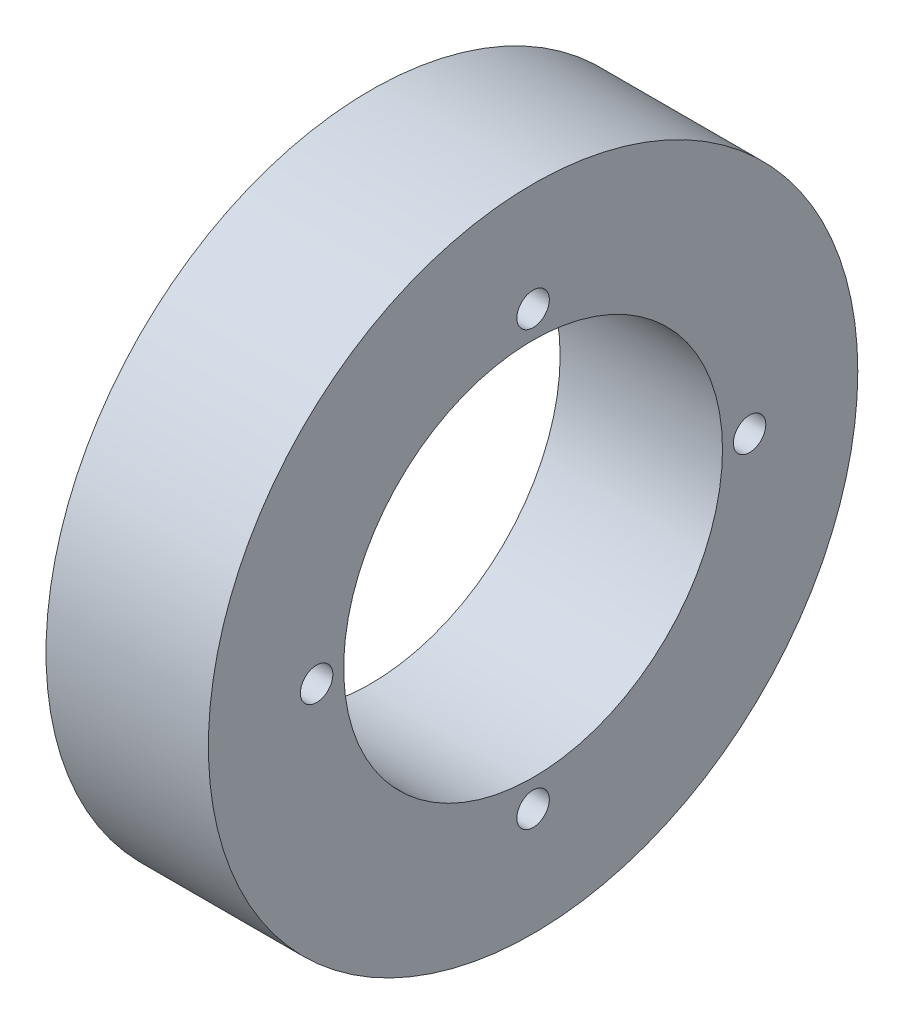
ISO-10303-21;
HEADER;
FILE_DESCRIPTION(('STEP AP214'),'2;1');
FILE_NAME('part.step','',(''),(''),'','','');
FILE_SCHEMA(('AUTOMOTIVE_DESIGN { 1 0 10303 214 1 1 1 1 }'));
ENDSEC;
DATA;
#1=APPLICATION_CONTEXT('core data for automotive mechanical design processes');
#2=APPLICATION_PROTOCOL_DEFINITION('international standard','automotive_design',2000,#1);
#3=PRODUCT_CONTEXT('',#1,'mechanical');
#4=PRODUCT('Part','Part','',(#3));
#5=PRODUCT_RELATED_PRODUCT_CATEGORY('part','',(#4));
#6=PRODUCT_DEFINITION_FORMATION('','',#4);
#7=PRODUCT_DEFINITION_CONTEXT('part definition',#1,'design');
#8=PRODUCT_DEFINITION('design','',#6,#7);
#9=PRODUCT_DEFINITION_SHAPE('','',#8);
#10=(LENGTH_UNIT() NAMED_UNIT(*) SI_UNIT(.MILLI.,.METRE.));
#11=(NAMED_UNIT(*) PLANE_ANGLE_UNIT() SI_UNIT($,.RADIAN.));
#12=(NAMED_UNIT(*) SI_UNIT($,.STERADIAN.) SOLID_ANGLE_UNIT());
#13=UNCERTAINTY_MEASURE_WITH_UNIT(LENGTH_MEASURE(1.E-05),#10,'distance_accuracy_value','');
#14=(GEOMETRIC_REPRESENTATION_CONTEXT(3) GLOBAL_UNCERTAINTY_ASSIGNED_CONTEXT((#13)) GLOBAL_UNIT_ASSIGNED_CONTEXT((#10,
#11,#12)) REPRESENTATION_CONTEXT('',''));
#15=CARTESIAN_POINT('',(0.,0.,0.));
#16=DIRECTION('',(0.,0.,1.));
#17=DIRECTION('',(1.,0.,0.));
#18=AXIS2_PLACEMENT_3D('',#15,#16,#17);
#19=CARTESIAN_POINT('',(7.5,0.,0.));
#20=DIRECTION('',(1.,0.,0.));
#21=DIRECTION('',(0.,0.,-1.));
#22=AXIS2_PLACEMENT_3D('',#19,#20,#21);
#23=PLANE('',#22);
#24=CARTESIAN_POINT('',(7.5,20.,0.));
#25=DIRECTION('',(1.,0.,0.));
#26=DIRECTION('',(0.,0.,-1.));
#27=AXIS2_PLACEMENT_3D('',#24,#25,#26);
#28=CIRCLE('',#27,1.5);
#29=CARTESIAN_POINT('',(7.5,20.,-1.5));
#30=VERTEX_POINT('',#29);
#31=EDGE_CURVE('E73',#30,#30,#28,.T.);
#32=ORIENTED_EDGE('',*,*,#31,.F.);
#33=EDGE_LOOP('',(#32));
#34=FACE_BOUND('',#33,.T.);
#35=CARTESIAN_POINT('',(7.5,0.,-20.));
#36=DIRECTION('',(1.,0.,0.));
#37=DIRECTION('',(0.,0.,-1.));
#38=AXIS2_PLACEMENT_3D('',#35,#36,#37);
#39=CIRCLE('',#38,1.5);
#40=CARTESIAN_POINT('',(7.5,0.,-21.5));
#41=VERTEX_POINT('',#40);
#42=EDGE_CURVE('E67',#41,#41,#39,.T.);
#43=ORIENTED_EDGE('',*,*,#42,.F.);
#44=EDGE_LOOP('',(#43));
#45=FACE_BOUND('',#44,.T.);
#46=CARTESIAN_POINT('',(7.5,-20.,1.39659253553725E-13));
#47=DIRECTION('',(1.,0.,0.));
#48=DIRECTION('',(0.,0.,-1.));
#49=AXIS2_PLACEMENT_3D('',#46,#47,#48);
#50=CIRCLE('',#49,1.5);
#51=CARTESIAN_POINT('',(7.5,-20.,-1.49999999999986));
#52=VERTEX_POINT('',#51);
#53=EDGE_CURVE('E61',#52,#52,#50,.T.);
#54=ORIENTED_EDGE('',*,*,#53,.F.);
#55=EDGE_LOOP('',(#54));
#56=FACE_BOUND('',#55,.T.);
#57=CARTESIAN_POINT('',(7.5,2.09488880330588E-13,20.));
#58=DIRECTION('',(1.,0.,0.));
#59=DIRECTION('',(0.,0.,-1.));
#60=AXIS2_PLACEMENT_3D('',#57,#58,#59);
#61=CIRCLE('',#60,1.5);
#62=CARTESIAN_POINT('',(7.5,2.09488880330588E-13,18.5));
#63=VERTEX_POINT('',#62);
#64=EDGE_CURVE('E55',#63,#63,#61,.T.);
#65=ORIENTED_EDGE('',*,*,#64,.F.);
#66=EDGE_LOOP('',(#65));
#67=FACE_BOUND('',#66,.T.);
#68=CARTESIAN_POINT('',(7.5,0.,0.));
#69=DIRECTION('',(1.,0.,0.));
#70=DIRECTION('',(0.,0.,-1.));
#71=AXIS2_PLACEMENT_3D('',#68,#69,#70);
#72=CIRCLE('',#71,30.);
#73=CARTESIAN_POINT('',(7.5,0.,-30.));
#74=VERTEX_POINT('',#73);
#75=EDGE_CURVE('E10',#74,#74,#72,.T.);
#76=ORIENTED_EDGE('',*,*,#75,.T.);
#77=EDGE_LOOP('',(#76));
#78=FACE_BOUND('',#77,.T.);
#79=CARTESIAN_POINT('',(7.5,0.,0.));
#80=DIRECTION('',(1.,0.,0.));
#81=DIRECTION('',(0.,0.,-1.));
#82=AXIS2_PLACEMENT_3D('',#79,#80,#81);
#83=CIRCLE('',#82,17.5);
#84=CARTESIAN_POINT('',(7.5,0.,-17.5));
#85=VERTEX_POINT('',#84);
#86=EDGE_CURVE('E47',#85,#85,#83,.T.);
#87=ORIENTED_EDGE('',*,*,#86,.F.);
#88=EDGE_LOOP('',(#87));
#89=FACE_BOUND('',#88,.T.);
#90=ADVANCED_FACE('F36',(#34,#45,#56,#67,#78,#89),#23,.T.);
#91=CARTESIAN_POINT('',(-7.5,0.,0.));
#92=DIRECTION('',(1.,0.,0.));
#93=DIRECTION('',(0.,0.,-1.));
#94=AXIS2_PLACEMENT_3D('',#91,#92,#93);
#95=PLANE('',#94);
#96=CARTESIAN_POINT('',(-7.5,20.,0.));
#97=DIRECTION('',(1.,0.,0.));
#98=DIRECTION('',(0.,0.,-1.));
#99=AXIS2_PLACEMENT_3D('',#96,#97,#98);
#100=CIRCLE('',#99,1.5);
#101=CARTESIAN_POINT('',(-7.5,20.,-1.5));
#102=VERTEX_POINT('',#101);
#103=EDGE_CURVE('E52',#102,#102,#100,.T.);
#104=ORIENTED_EDGE('',*,*,#103,.T.);
#105=EDGE_LOOP('',(#104));
#106=FACE_BOUND('',#105,.T.);
#107=CARTESIAN_POINT('',(-7.5,0.,-20.));
#108=DIRECTION('',(1.,0.,0.));
#109=DIRECTION('',(0.,0.,-1.));
#110=AXIS2_PLACEMENT_3D('',#107,#108,#109);
#111=CIRCLE('',#110,1.5);
#112=CARTESIAN_POINT('',(-7.5,0.,-21.5));
#113=VERTEX_POINT('',#112);
#114=EDGE_CURVE('E70',#113,#113,#111,.T.);
#115=ORIENTED_EDGE('',*,*,#114,.T.);
#116=EDGE_LOOP('',(#115));
#117=FACE_BOUND('',#116,.T.);
#118=CARTESIAN_POINT('',(-7.5,-20.,1.39659253553725E-13));
#119=DIRECTION('',(1.,0.,0.));
#120=DIRECTION('',(0.,0.,-1.));
#121=AXIS2_PLACEMENT_3D('',#118,#119,#120);
#122=CIRCLE('',#121,1.5);
#123=CARTESIAN_POINT('',(-7.5,-20.,-1.49999999999986));
#124=VERTEX_POINT('',#123);
#125=EDGE_CURVE('E64',#124,#124,#122,.T.);
#126=ORIENTED_EDGE('',*,*,#125,.T.);
#127=EDGE_LOOP('',(#126));
#128=FACE_BOUND('',#127,.T.);
#129=CARTESIAN_POINT('',(-7.5,2.09488880330588E-13,20.));
#130=DIRECTION('',(1.,0.,0.));
#131=DIRECTION('',(0.,0.,-1.));
#132=AXIS2_PLACEMENT_3D('',#129,#130,#131);
#133=CIRCLE('',#132,1.5);
#134=CARTESIAN_POINT('',(-7.5,2.09488880330588E-13,18.5));
#135=VERTEX_POINT('',#134);
#136=EDGE_CURVE('E58',#135,#135,#133,.T.);
#137=ORIENTED_EDGE('',*,*,#136,.T.);
#138=EDGE_LOOP('',(#137));
#139=FACE_BOUND('',#138,.T.);
#140=CARTESIAN_POINT('',(-7.5,0.,0.));
#141=DIRECTION('',(1.,0.,0.));
#142=DIRECTION('',(0.,0.,-1.));
#143=AXIS2_PLACEMENT_3D('',#140,#141,#142);
#144=CIRCLE('',#143,30.);
#145=CARTESIAN_POINT('',(-7.5,0.,-30.));
#146=VERTEX_POINT('',#145);
#147=EDGE_CURVE('E40',#146,#146,#144,.T.);
#148=ORIENTED_EDGE('',*,*,#147,.F.);
#149=EDGE_LOOP('',(#148));
#150=FACE_BOUND('',#149,.T.);
#151=CARTESIAN_POINT('',(-7.5,0.,0.));
#152=DIRECTION('',(1.,0.,0.));
#153=DIRECTION('',(0.,0.,-1.));
#154=AXIS2_PLACEMENT_3D('',#151,#152,#153);
#155=CIRCLE('',#154,17.5);
#156=CARTESIAN_POINT('',(-7.5,0.,-17.5));
#157=VERTEX_POINT('',#156);
#158=EDGE_CURVE('E49',#157,#157,#155,.T.);
#159=ORIENTED_EDGE('',*,*,#158,.T.);
#160=EDGE_LOOP('',(#159));
#161=FACE_BOUND('',#160,.T.);
#162=ADVANCED_FACE('F79',(#106,#117,#128,#139,#150,#161),#95,.F.);
#163=CARTESIAN_POINT('',(7.5,0.,0.));
#164=DIRECTION('',(-1.,0.,0.));
#165=DIRECTION('',(0.,0.,1.));
#166=AXIS2_PLACEMENT_3D('',#163,#164,#165);
#167=CYLINDRICAL_SURFACE('',#166,30.);
#168=ORIENTED_EDGE('',*,*,#75,.F.);
#169=EDGE_LOOP('',(#168));
#170=FACE_BOUND('',#169,.T.);
#171=ORIENTED_EDGE('',*,*,#147,.T.);
#172=EDGE_LOOP('',(#171));
#173=FACE_BOUND('',#172,.T.);
#174=ADVANCED_FACE('F38',(#170,#173),#167,.T.);
#175=CARTESIAN_POINT('',(7.5,0.,0.));
#176=DIRECTION('',(-1.,0.,0.));
#177=DIRECTION('',(0.,0.,1.));
#178=AXIS2_PLACEMENT_3D('',#175,#176,#177);
#179=CYLINDRICAL_SURFACE('',#178,17.5);
#180=ORIENTED_EDGE('',*,*,#86,.T.);
#181=EDGE_LOOP('',(#180));
#182=FACE_BOUND('',#181,.T.);
#183=ORIENTED_EDGE('',*,*,#158,.F.);
#184=EDGE_LOOP('',(#183));
#185=FACE_BOUND('',#184,.T.);
#186=ADVANCED_FACE('F100',(#182,#185),#179,.F.);
#187=CARTESIAN_POINT('',(-7.5,2.09488880330588E-13,20.));
#188=DIRECTION('',(1.,0.,0.));
#189=DIRECTION('',(0.,0.,-1.));
#190=AXIS2_PLACEMENT_3D('',#187,#188,#189);
#191=CYLINDRICAL_SURFACE('',#190,1.5);
#192=ORIENTED_EDGE('',*,*,#136,.F.);
#193=EDGE_LOOP('',(#192));
#194=FACE_BOUND('',#193,.T.);
#195=ORIENTED_EDGE('',*,*,#64,.T.);
#196=EDGE_LOOP('',(#195));
#197=FACE_BOUND('',#196,.T.);
#198=ADVANCED_FACE('F103',(#194,#197),#191,.F.);
#199=CARTESIAN_POINT('',(-7.5,-20.,1.39659253553725E-13));
#200=DIRECTION('',(1.,0.,0.));
#201=DIRECTION('',(0.,0.,-1.));
#202=AXIS2_PLACEMENT_3D('',#199,#200,#201);
#203=CYLINDRICAL_SURFACE('',#202,1.5);
#204=ORIENTED_EDGE('',*,*,#125,.F.);
#205=EDGE_LOOP('',(#204));
#206=FACE_BOUND('',#205,.T.);
#207=ORIENTED_EDGE('',*,*,#53,.T.);
#208=EDGE_LOOP('',(#207));
#209=FACE_BOUND('',#208,.T.);
#210=ADVANCED_FACE('F115',(#206,#209),#203,.F.);
#211=CARTESIAN_POINT('',(-7.5,0.,-20.));
#212=DIRECTION('',(1.,0.,0.));
#213=DIRECTION('',(0.,0.,-1.));
#214=AXIS2_PLACEMENT_3D('',#211,#212,#213);
#215=CYLINDRICAL_SURFACE('',#214,1.5);
#216=ORIENTED_EDGE('',*,*,#114,.F.);
#217=EDGE_LOOP('',(#216));
#218=FACE_BOUND('',#217,.T.);
#219=ORIENTED_EDGE('',*,*,#42,.T.);
#220=EDGE_LOOP('',(#219));
#221=FACE_BOUND('',#220,.T.);
#222=ADVANCED_FACE('F85',(#218,#221),#215,.F.);
#223=CARTESIAN_POINT('',(-7.5,20.,0.));
#224=DIRECTION('',(1.,0.,0.));
#225=DIRECTION('',(0.,0.,-1.));
#226=AXIS2_PLACEMENT_3D('',#223,#224,#225);
#227=CYLINDRICAL_SURFACE('',#226,1.5);
#228=ORIENTED_EDGE('',*,*,#103,.F.);
#229=EDGE_LOOP('',(#228));
#230=FACE_BOUND('',#229,.T.);
#231=ORIENTED_EDGE('',*,*,#31,.T.);
#232=EDGE_LOOP('',(#231));
#233=FACE_BOUND('',#232,.T.);
#234=ADVANCED_FACE('F82',(#230,#233),#227,.F.);
#235=CLOSED_SHELL('',(#90,#162,#174,#186,#198,#210,#222,#234));
#236=MANIFOLD_SOLID_BREP('B2',#235);
#237=ADVANCED_BREP_SHAPE_REPRESENTATION('',(#18,#236),#14);
#238=SHAPE_DEFINITION_REPRESENTATION(#9,#237);
ENDSEC;
END-ISO-10303-21;
